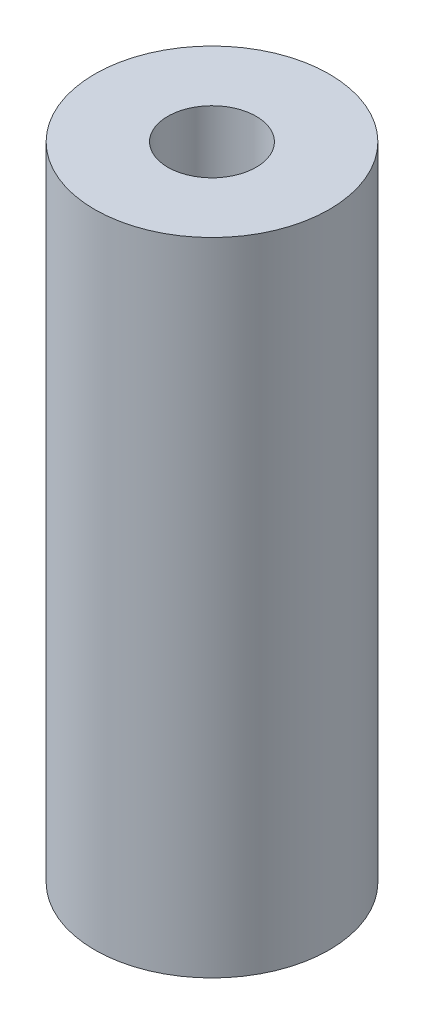
ISO-10303-21;
HEADER;
FILE_DESCRIPTION(('STEP AP214'),'2;1');
FILE_NAME('part.step','',(''),(''),'','','');
FILE_SCHEMA(('AUTOMOTIVE_DESIGN { 1 0 10303 214 1 1 1 1 }'));
ENDSEC;
DATA;
#1=APPLICATION_CONTEXT('core data for automotive mechanical design processes');
#2=APPLICATION_PROTOCOL_DEFINITION('international standard','automotive_design',2000,#1);
#3=PRODUCT_CONTEXT('',#1,'mechanical');
#4=PRODUCT('Part','Part','',(#3));
#5=PRODUCT_RELATED_PRODUCT_CATEGORY('part','',(#4));
#6=PRODUCT_DEFINITION_FORMATION('','',#4);
#7=PRODUCT_DEFINITION_CONTEXT('part definition',#1,'design');
#8=PRODUCT_DEFINITION('design','',#6,#7);
#9=PRODUCT_DEFINITION_SHAPE('','',#8);
#10=(LENGTH_UNIT() NAMED_UNIT(*) SI_UNIT(.MILLI.,.METRE.));
#11=(NAMED_UNIT(*) PLANE_ANGLE_UNIT() SI_UNIT($,.RADIAN.));
#12=(NAMED_UNIT(*) SI_UNIT($,.STERADIAN.) SOLID_ANGLE_UNIT());
#13=UNCERTAINTY_MEASURE_WITH_UNIT(LENGTH_MEASURE(1.E-05),#10,'distance_accuracy_value','');
#14=(GEOMETRIC_REPRESENTATION_CONTEXT(3) GLOBAL_UNCERTAINTY_ASSIGNED_CONTEXT((#13)) GLOBAL_UNIT_ASSIGNED_CONTEXT((#10,
#11,#12)) REPRESENTATION_CONTEXT('',''));
#15=CARTESIAN_POINT('',(0.,0.,0.));
#16=DIRECTION('',(0.,0.,1.));
#17=DIRECTION('',(1.,0.,0.));
#18=AXIS2_PLACEMENT_3D('',#15,#16,#17);
#19=CARTESIAN_POINT('',(0.,16.4,0.));
#20=DIRECTION('',(0.,-1.,0.));
#21=DIRECTION('',(0.,0.,-1.));
#22=AXIS2_PLACEMENT_3D('',#19,#20,#21);
#23=CYLINDRICAL_SURFACE('',#22,3.);
#24=CARTESIAN_POINT('',(0.,16.4,0.));
#25=DIRECTION('',(0.,1.,0.));
#26=DIRECTION('',(0.,0.,1.));
#27=AXIS2_PLACEMENT_3D('',#24,#25,#26);
#28=CIRCLE('',#27,3.);
#29=CARTESIAN_POINT('',(0.,16.4,3.));
#30=VERTEX_POINT('',#29);
#31=EDGE_CURVE('E10',#30,#30,#28,.T.);
#32=ORIENTED_EDGE('',*,*,#31,.F.);
#33=EDGE_LOOP('',(#32));
#34=FACE_BOUND('',#33,.T.);
#35=CARTESIAN_POINT('',(0.,0.,0.));
#36=DIRECTION('',(0.,1.,0.));
#37=DIRECTION('',(0.,0.,1.));
#38=AXIS2_PLACEMENT_3D('',#35,#36,#37);
#39=CIRCLE('',#38,3.);
#40=CARTESIAN_POINT('',(0.,0.,3.));
#41=VERTEX_POINT('',#40);
#42=EDGE_CURVE('E35',#41,#41,#39,.T.);
#43=ORIENTED_EDGE('',*,*,#42,.T.);
#44=EDGE_LOOP('',(#43));
#45=FACE_BOUND('',#44,.T.);
#46=ADVANCED_FACE('F32',(#34,#45),#23,.T.);
#47=CARTESIAN_POINT('',(0.,16.4,0.));
#48=DIRECTION('',(0.,1.,0.));
#49=DIRECTION('',(0.,0.,1.));
#50=AXIS2_PLACEMENT_3D('',#47,#48,#49);
#51=PLANE('',#50);
#52=CARTESIAN_POINT('',(0.,16.4,0.));
#53=DIRECTION('',(0.,1.,0.));
#54=DIRECTION('',(0.,0.,1.));
#55=AXIS2_PLACEMENT_3D('',#52,#53,#54);
#56=CIRCLE('',#55,1.1303);
#57=CARTESIAN_POINT('',(0.,16.4,1.1303));
#58=VERTEX_POINT('',#57);
#59=EDGE_CURVE('E46',#58,#58,#56,.T.);
#60=ORIENTED_EDGE('',*,*,#59,.F.);
#61=EDGE_LOOP('',(#60));
#62=FACE_BOUND('',#61,.T.);
#63=ORIENTED_EDGE('',*,*,#31,.T.);
#64=EDGE_LOOP('',(#63));
#65=FACE_BOUND('',#64,.T.);
#66=ADVANCED_FACE('F52',(#62,#65),#51,.T.);
#67=CARTESIAN_POINT('',(0.,0.,0.));
#68=DIRECTION('',(0.,1.,0.));
#69=DIRECTION('',(0.,0.,1.));
#70=AXIS2_PLACEMENT_3D('',#67,#68,#69);
#71=PLANE('',#70);
#72=CARTESIAN_POINT('',(0.,0.,0.));
#73=DIRECTION('',(0.,1.,0.));
#74=DIRECTION('',(0.,0.,1.));
#75=AXIS2_PLACEMENT_3D('',#72,#73,#74);
#76=CIRCLE('',#75,1.1303);
#77=CARTESIAN_POINT('',(0.,0.,1.1303));
#78=VERTEX_POINT('',#77);
#79=EDGE_CURVE('E42',#78,#78,#76,.T.);
#80=ORIENTED_EDGE('',*,*,#79,.T.);
#81=EDGE_LOOP('',(#80));
#82=FACE_BOUND('',#81,.T.);
#83=ORIENTED_EDGE('',*,*,#42,.F.);
#84=EDGE_LOOP('',(#83));
#85=FACE_BOUND('',#84,.T.);
#86=ADVANCED_FACE('F54',(#82,#85),#71,.F.);
#87=CARTESIAN_POINT('',(0.,16.4,0.));
#88=DIRECTION('',(0.,1.,0.));
#89=DIRECTION('',(0.,0.,1.));
#90=AXIS2_PLACEMENT_3D('',#87,#88,#89);
#91=CYLINDRICAL_SURFACE('',#90,1.1303);
#92=ORIENTED_EDGE('',*,*,#79,.F.);
#93=EDGE_LOOP('',(#92));
#94=FACE_BOUND('',#93,.T.);
#95=ORIENTED_EDGE('',*,*,#59,.T.);
#96=EDGE_LOOP('',(#95));
#97=FACE_BOUND('',#96,.T.);
#98=ADVANCED_FACE('F50',(#94,#97),#91,.F.);
#99=CLOSED_SHELL('',(#46,#66,#86,#98));
#100=MANIFOLD_SOLID_BREP('B2',#99);
#101=ADVANCED_BREP_SHAPE_REPRESENTATION('',(#18,#100),#14);
#102=SHAPE_DEFINITION_REPRESENTATION(#9,#101);
ENDSEC;
END-ISO-10303-21;
